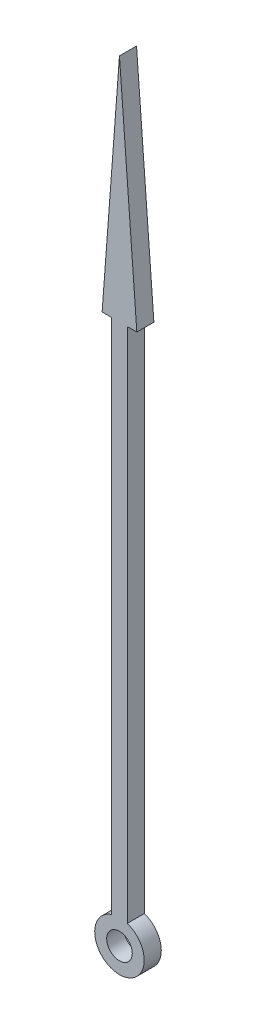
ISO-10303-21;
HEADER;
FILE_DESCRIPTION(('STEP AP214'),'2;1');
FILE_NAME('part.step','',(''),(''),'','','');
FILE_SCHEMA(('AUTOMOTIVE_DESIGN { 1 0 10303 214 1 1 1 1 }'));
ENDSEC;
DATA;
#1=APPLICATION_CONTEXT('core data for automotive mechanical design processes');
#2=APPLICATION_PROTOCOL_DEFINITION('international standard','automotive_design',2000,#1);
#3=PRODUCT_CONTEXT('',#1,'mechanical');
#4=PRODUCT('Part','Part','',(#3));
#5=PRODUCT_RELATED_PRODUCT_CATEGORY('part','',(#4));
#6=PRODUCT_DEFINITION_FORMATION('','',#4);
#7=PRODUCT_DEFINITION_CONTEXT('part definition',#1,'design');
#8=PRODUCT_DEFINITION('design','',#6,#7);
#9=PRODUCT_DEFINITION_SHAPE('','',#8);
#10=(LENGTH_UNIT() NAMED_UNIT(*) SI_UNIT(.MILLI.,.METRE.));
#11=(NAMED_UNIT(*) PLANE_ANGLE_UNIT() SI_UNIT($,.RADIAN.));
#12=(NAMED_UNIT(*) SI_UNIT($,.STERADIAN.) SOLID_ANGLE_UNIT());
#13=UNCERTAINTY_MEASURE_WITH_UNIT(LENGTH_MEASURE(1.E-05),#10,'distance_accuracy_value','');
#14=(GEOMETRIC_REPRESENTATION_CONTEXT(3) GLOBAL_UNCERTAINTY_ASSIGNED_CONTEXT((#13)) GLOBAL_UNIT_ASSIGNED_CONTEXT((#10,
#11,#12)) REPRESENTATION_CONTEXT('',''));
#15=CARTESIAN_POINT('',(0.,0.,0.));
#16=DIRECTION('',(0.,0.,1.));
#17=DIRECTION('',(1.,0.,0.));
#18=AXIS2_PLACEMENT_3D('',#15,#16,#17);
#19=CARTESIAN_POINT('',(0.,0.,0.2));
#20=DIRECTION('',(0.,0.,1.));
#21=DIRECTION('',(1.,0.,0.));
#22=AXIS2_PLACEMENT_3D('',#19,#20,#21);
#23=PLANE('',#22);
#24=CARTESIAN_POINT('',(0.,0.,0.2));
#25=DIRECTION('',(0.,0.,1.));
#26=DIRECTION('',(1.,0.,0.));
#27=AXIS2_PLACEMENT_3D('',#24,#25,#26);
#28=CIRCLE('',#27,0.29);
#29=CARTESIAN_POINT('',(-0.0912214167594312,0.275279227557043,0.2));
#30=VERTEX_POINT('',#29);
#31=CARTESIAN_POINT('',(0.0912214167594312,0.275279227557043,0.2));
#32=VERTEX_POINT('',#31);
#33=EDGE_CURVE('E11',#30,#32,#28,.T.);
#34=ORIENTED_EDGE('',*,*,#33,.T.);
#35=DIRECTION('',(0.,-1.,0.));
#36=VECTOR('',#35,1.);
#37=CARTESIAN_POINT('',(0.0912214167594319,6.33093131411949,0.2));
#38=LINE('',#37,#36);
#39=CARTESIAN_POINT('',(0.0912214167594319,6.33093131411949,0.2));
#40=VERTEX_POINT('',#39);
#41=EDGE_CURVE('E125',#40,#32,#38,.T.);
#42=ORIENTED_EDGE('',*,*,#41,.F.);
#43=DIRECTION('',(-1.,0.,0.));
#44=VECTOR('',#43,1.);
#45=CARTESIAN_POINT('',(0.203353637611032,6.33093131411949,0.2));
#46=LINE('',#45,#44);
#47=CARTESIAN_POINT('',(0.203353637611032,6.33093131411949,0.2));
#48=VERTEX_POINT('',#47);
#49=EDGE_CURVE('E113',#48,#40,#46,.T.);
#50=ORIENTED_EDGE('',*,*,#49,.F.);
#51=DIRECTION('',(0.0751034502327518,-0.997175747680988,0.));
#52=VECTOR('',#51,1.);
#53=CARTESIAN_POINT('',(0.,9.03093131411949,0.2));
#54=LINE('',#53,#52);
#55=CARTESIAN_POINT('',(0.,9.03093131411949,0.2));
#56=VERTEX_POINT('',#55);
#57=EDGE_CURVE('E120',#56,#48,#54,.T.);
#58=ORIENTED_EDGE('',*,*,#57,.F.);
#59=DIRECTION('',(-0.0751034502327518,-0.997175747680988,0.));
#60=VECTOR('',#59,1.);
#61=CARTESIAN_POINT('',(0.,9.03093131411949,0.2));
#62=LINE('',#61,#60);
#63=CARTESIAN_POINT('',(-0.203353637611032,6.33093131411949,0.2));
#64=VERTEX_POINT('',#63);
#65=EDGE_CURVE('E142',#56,#64,#62,.T.);
#66=ORIENTED_EDGE('',*,*,#65,.T.);
#67=DIRECTION('',(1.,0.,0.));
#68=VECTOR('',#67,1.);
#69=CARTESIAN_POINT('',(-0.203353637611032,6.33093131411949,0.2));
#70=LINE('',#69,#68);
#71=CARTESIAN_POINT('',(-0.0912214167594319,6.33093131411949,0.2));
#72=VERTEX_POINT('',#71);
#73=EDGE_CURVE('E134',#64,#72,#70,.T.);
#74=ORIENTED_EDGE('',*,*,#73,.T.);
#75=DIRECTION('',(0.,-1.,0.));
#76=VECTOR('',#75,1.);
#77=CARTESIAN_POINT('',(-0.0912214167594319,6.33093131411949,0.2));
#78=LINE('',#77,#76);
#79=EDGE_CURVE('E130',#72,#30,#78,.T.);
#80=ORIENTED_EDGE('',*,*,#79,.T.);
#81=EDGE_LOOP('',(#34,#42,#50,#58,#66,#74,#80));
#82=FACE_BOUND('',#81,.T.);
#83=CARTESIAN_POINT('',(0.,0.,0.2));
#84=DIRECTION('',(0.,0.,1.));
#85=DIRECTION('',(1.,0.,0.));
#86=AXIS2_PLACEMENT_3D('',#83,#84,#85);
#87=CIRCLE('',#86,0.15);
#88=CARTESIAN_POINT('',(0.15,0.,0.2));
#89=VERTEX_POINT('',#88);
#90=EDGE_CURVE('E156',#89,#89,#87,.T.);
#91=ORIENTED_EDGE('',*,*,#90,.F.);
#92=EDGE_LOOP('',(#91));
#93=FACE_BOUND('',#92,.T.);
#94=ADVANCED_FACE('F39',(#82,#93),#23,.T.);
#95=CARTESIAN_POINT('',(0.,0.,0.));
#96=DIRECTION('',(0.,0.,1.));
#97=DIRECTION('',(1.,0.,0.));
#98=AXIS2_PLACEMENT_3D('',#95,#96,#97);
#99=PLANE('',#98);
#100=DIRECTION('',(0.,-1.,0.));
#101=VECTOR('',#100,1.);
#102=CARTESIAN_POINT('',(0.0912214167594319,6.33093131411949,0.));
#103=LINE('',#102,#101);
#104=CARTESIAN_POINT('',(0.0912214167594319,6.33093131411949,0.));
#105=VERTEX_POINT('',#104);
#106=CARTESIAN_POINT('',(0.0912214167594312,0.275279227557043,0.));
#107=VERTEX_POINT('',#106);
#108=EDGE_CURVE('E101',#105,#107,#103,.T.);
#109=ORIENTED_EDGE('',*,*,#108,.T.);
#110=CARTESIAN_POINT('',(0.,0.,0.));
#111=DIRECTION('',(0.,0.,1.));
#112=DIRECTION('',(1.,0.,0.));
#113=AXIS2_PLACEMENT_3D('',#110,#111,#112);
#114=CIRCLE('',#113,0.29);
#115=CARTESIAN_POINT('',(-0.0912214167594312,0.275279227557043,0.));
#116=VERTEX_POINT('',#115);
#117=EDGE_CURVE('E43',#116,#107,#114,.T.);
#118=ORIENTED_EDGE('',*,*,#117,.F.);
#119=DIRECTION('',(0.,-1.,0.));
#120=VECTOR('',#119,1.);
#121=CARTESIAN_POINT('',(-0.0912214167594319,6.33093131411949,0.));
#122=LINE('',#121,#120);
#123=CARTESIAN_POINT('',(-0.0912214167594319,6.33093131411949,0.));
#124=VERTEX_POINT('',#123);
#125=EDGE_CURVE('E131',#124,#116,#122,.T.);
#126=ORIENTED_EDGE('',*,*,#125,.F.);
#127=DIRECTION('',(1.,0.,0.));
#128=VECTOR('',#127,1.);
#129=CARTESIAN_POINT('',(-0.203353637611032,6.33093131411949,0.));
#130=LINE('',#129,#128);
#131=CARTESIAN_POINT('',(-0.203353637611032,6.33093131411949,0.));
#132=VERTEX_POINT('',#131);
#133=EDGE_CURVE('E137',#132,#124,#130,.T.);
#134=ORIENTED_EDGE('',*,*,#133,.F.);
#135=DIRECTION('',(-0.0751034502327518,-0.997175747680988,0.));
#136=VECTOR('',#135,1.);
#137=CARTESIAN_POINT('',(0.,9.03093131411949,0.));
#138=LINE('',#137,#136);
#139=CARTESIAN_POINT('',(0.,9.03093131411949,0.));
#140=VERTEX_POINT('',#139);
#141=EDGE_CURVE('E133',#140,#132,#138,.T.);
#142=ORIENTED_EDGE('',*,*,#141,.F.);
#143=DIRECTION('',(0.0751034502327518,-0.997175747680988,0.));
#144=VECTOR('',#143,1.);
#145=CARTESIAN_POINT('',(0.,9.03093131411949,0.));
#146=LINE('',#145,#144);
#147=CARTESIAN_POINT('',(0.203353637611032,6.33093131411949,0.));
#148=VERTEX_POINT('',#147);
#149=EDGE_CURVE('E104',#140,#148,#146,.T.);
#150=ORIENTED_EDGE('',*,*,#149,.T.);
#151=DIRECTION('',(-1.,0.,0.));
#152=VECTOR('',#151,1.);
#153=CARTESIAN_POINT('',(0.203353637611032,6.33093131411949,0.));
#154=LINE('',#153,#152);
#155=EDGE_CURVE('E96',#148,#105,#154,.T.);
#156=ORIENTED_EDGE('',*,*,#155,.T.);
#157=EDGE_LOOP('',(#109,#118,#126,#134,#142,#150,#156));
#158=FACE_BOUND('',#157,.T.);
#159=CARTESIAN_POINT('',(0.,0.,0.));
#160=DIRECTION('',(0.,0.,1.));
#161=DIRECTION('',(1.,0.,0.));
#162=AXIS2_PLACEMENT_3D('',#159,#160,#161);
#163=CIRCLE('',#162,0.15);
#164=CARTESIAN_POINT('',(0.15,0.,0.));
#165=VERTEX_POINT('',#164);
#166=EDGE_CURVE('E155',#165,#165,#163,.T.);
#167=ORIENTED_EDGE('',*,*,#166,.T.);
#168=EDGE_LOOP('',(#167));
#169=FACE_BOUND('',#168,.T.);
#170=ADVANCED_FACE('F98',(#158,#169),#99,.F.);
#171=CARTESIAN_POINT('',(0.,0.,0.2));
#172=DIRECTION('',(0.,0.,-1.));
#173=DIRECTION('',(-1.,0.,0.));
#174=AXIS2_PLACEMENT_3D('',#171,#172,#173);
#175=CYLINDRICAL_SURFACE('',#174,0.29);
#176=DIRECTION('',(0.,0.,-1.));
#177=VECTOR('',#176,1.);
#178=CARTESIAN_POINT('',(0.0912214167594312,0.275279227557043,0.2));
#179=LINE('',#178,#177);
#180=EDGE_CURVE('E57',#32,#107,#179,.T.);
#181=ORIENTED_EDGE('',*,*,#180,.F.);
#182=ORIENTED_EDGE('',*,*,#33,.F.);
#183=DIRECTION('',(0.,0.,-1.));
#184=VECTOR('',#183,1.);
#185=CARTESIAN_POINT('',(-0.0912214167594312,0.275279227557043,0.2));
#186=LINE('',#185,#184);
#187=EDGE_CURVE('E149',#30,#116,#186,.T.);
#188=ORIENTED_EDGE('',*,*,#187,.T.);
#189=ORIENTED_EDGE('',*,*,#117,.T.);
#190=EDGE_LOOP('',(#181,#182,#188,#189));
#191=FACE_BOUND('',#190,.T.);
#192=ADVANCED_FACE('F41',(#191),#175,.T.);
#193=CARTESIAN_POINT('',(0.,0.,0.2));
#194=DIRECTION('',(0.,0.,-1.));
#195=DIRECTION('',(-1.,0.,0.));
#196=AXIS2_PLACEMENT_3D('',#193,#194,#195);
#197=CYLINDRICAL_SURFACE('',#196,0.15);
#198=ORIENTED_EDGE('',*,*,#166,.F.);
#199=EDGE_LOOP('',(#198));
#200=FACE_BOUND('',#199,.T.);
#201=ORIENTED_EDGE('',*,*,#90,.T.);
#202=EDGE_LOOP('',(#201));
#203=FACE_BOUND('',#202,.T.);
#204=ADVANCED_FACE('F162',(#200,#203),#197,.F.);
#205=CARTESIAN_POINT('',(-0.0912214167594319,6.33093131411949,0.));
#206=DIRECTION('',(-1.,0.,0.));
#207=DIRECTION('',(0.,-1.,0.));
#208=AXIS2_PLACEMENT_3D('',#205,#206,#207);
#209=PLANE('',#208);
#210=ORIENTED_EDGE('',*,*,#187,.F.);
#211=ORIENTED_EDGE('',*,*,#79,.F.);
#212=DIRECTION('',(0.,0.,1.));
#213=VECTOR('',#212,1.);
#214=CARTESIAN_POINT('',(-0.0912214167594319,6.33093131411949,0.));
#215=LINE('',#214,#213);
#216=EDGE_CURVE('E147',#124,#72,#215,.T.);
#217=ORIENTED_EDGE('',*,*,#216,.F.);
#218=ORIENTED_EDGE('',*,*,#125,.T.);
#219=EDGE_LOOP('',(#210,#211,#217,#218));
#220=FACE_BOUND('',#219,.T.);
#221=ADVANCED_FACE('F165',(#220),#209,.T.);
#222=CARTESIAN_POINT('',(-0.203353637611032,6.33093131411949,0.));
#223=DIRECTION('',(0.,-1.,0.));
#224=DIRECTION('',(0.,0.,-1.));
#225=AXIS2_PLACEMENT_3D('',#222,#223,#224);
#226=PLANE('',#225);
#227=ORIENTED_EDGE('',*,*,#73,.F.);
#228=DIRECTION('',(0.,0.,1.));
#229=VECTOR('',#228,1.);
#230=CARTESIAN_POINT('',(-0.203353637611032,6.33093131411949,0.));
#231=LINE('',#230,#229);
#232=EDGE_CURVE('E150',#132,#64,#231,.T.);
#233=ORIENTED_EDGE('',*,*,#232,.F.);
#234=ORIENTED_EDGE('',*,*,#133,.T.);
#235=ORIENTED_EDGE('',*,*,#216,.T.);
#236=EDGE_LOOP('',(#227,#233,#234,#235));
#237=FACE_BOUND('',#236,.T.);
#238=ADVANCED_FACE('F179',(#237),#226,.T.);
#239=CARTESIAN_POINT('',(0.,9.03093131411949,0.));
#240=DIRECTION('',(-0.997175747680988,0.0751034502327518,0.));
#241=DIRECTION('',(-0.0751034502327518,-0.997175747680988,0.));
#242=AXIS2_PLACEMENT_3D('',#239,#240,#241);
#243=PLANE('',#242);
#244=ORIENTED_EDGE('',*,*,#65,.F.);
#245=DIRECTION('',(0.,0.,1.));
#246=VECTOR('',#245,1.);
#247=CARTESIAN_POINT('',(0.,9.03093131411949,0.));
#248=LINE('',#247,#246);
#249=EDGE_CURVE('E140',#140,#56,#248,.T.);
#250=ORIENTED_EDGE('',*,*,#249,.F.);
#251=ORIENTED_EDGE('',*,*,#141,.T.);
#252=ORIENTED_EDGE('',*,*,#232,.T.);
#253=EDGE_LOOP('',(#244,#250,#251,#252));
#254=FACE_BOUND('',#253,.T.);
#255=ADVANCED_FACE('F181',(#254),#243,.T.);
#256=CARTESIAN_POINT('',(0.203353637611032,6.33093131411949,0.));
#257=DIRECTION('',(0.,1.,0.));
#258=DIRECTION('',(0.,0.,1.));
#259=AXIS2_PLACEMENT_3D('',#256,#257,#258);
#260=PLANE('',#259);
#261=ORIENTED_EDGE('',*,*,#49,.T.);
#262=DIRECTION('',(0.,0.,1.));
#263=VECTOR('',#262,1.);
#264=CARTESIAN_POINT('',(0.0912214167594319,6.33093131411949,0.));
#265=LINE('',#264,#263);
#266=EDGE_CURVE('E110',#105,#40,#265,.T.);
#267=ORIENTED_EDGE('',*,*,#266,.F.);
#268=ORIENTED_EDGE('',*,*,#155,.F.);
#269=DIRECTION('',(0.,0.,1.));
#270=VECTOR('',#269,1.);
#271=CARTESIAN_POINT('',(0.203353637611032,6.33093131411949,0.));
#272=LINE('',#271,#270);
#273=EDGE_CURVE('E117',#148,#48,#272,.T.);
#274=ORIENTED_EDGE('',*,*,#273,.T.);
#275=EDGE_LOOP('',(#261,#267,#268,#274));
#276=FACE_BOUND('',#275,.T.);
#277=ADVANCED_FACE('F111',(#276),#260,.F.);
#278=CARTESIAN_POINT('',(0.,9.03093131411949,0.));
#279=DIRECTION('',(-0.997175747680988,-0.0751034502327518,0.));
#280=DIRECTION('',(0.0751034502327518,-0.997175747680988,0.));
#281=AXIS2_PLACEMENT_3D('',#278,#279,#280);
#282=PLANE('',#281);
#283=ORIENTED_EDGE('',*,*,#57,.T.);
#284=ORIENTED_EDGE('',*,*,#273,.F.);
#285=ORIENTED_EDGE('',*,*,#149,.F.);
#286=ORIENTED_EDGE('',*,*,#249,.T.);
#287=EDGE_LOOP('',(#283,#284,#285,#286));
#288=FACE_BOUND('',#287,.T.);
#289=ADVANCED_FACE('F189',(#288),#282,.F.);
#290=CARTESIAN_POINT('',(0.0912214167594319,6.33093131411949,0.));
#291=DIRECTION('',(-1.,0.,0.));
#292=DIRECTION('',(0.,-1.,0.));
#293=AXIS2_PLACEMENT_3D('',#290,#291,#292);
#294=PLANE('',#293);
#295=ORIENTED_EDGE('',*,*,#41,.T.);
#296=ORIENTED_EDGE('',*,*,#180,.T.);
#297=ORIENTED_EDGE('',*,*,#108,.F.);
#298=ORIENTED_EDGE('',*,*,#266,.T.);
#299=EDGE_LOOP('',(#295,#296,#297,#298));
#300=FACE_BOUND('',#299,.T.);
#301=ADVANCED_FACE('F119',(#300),#294,.F.);
#302=CLOSED_SHELL('',(#94,#170,#192,#204,#221,#238,#255,#277,#289,#301));
#303=MANIFOLD_SOLID_BREP('B2',#302);
#304=ADVANCED_BREP_SHAPE_REPRESENTATION('',(#18,#303),#14);
#305=SHAPE_DEFINITION_REPRESENTATION(#9,#304);
ENDSEC;
END-ISO-10303-21;
